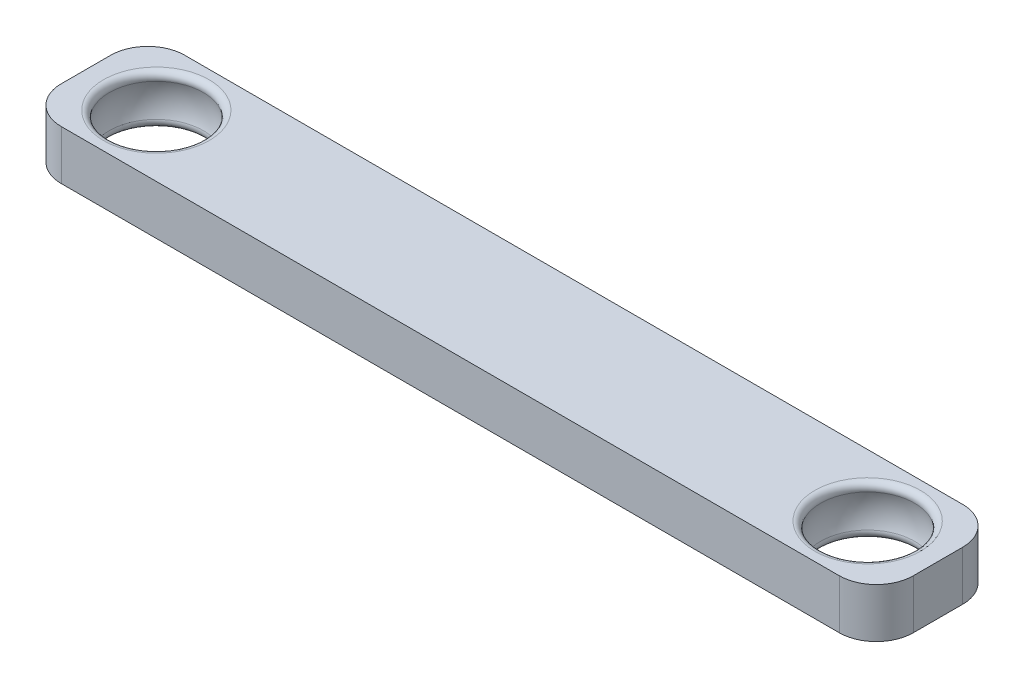
ISO-10303-21;
HEADER;
FILE_DESCRIPTION(('STEP AP214'),'2;1');
FILE_NAME('part.step','',(''),(''),'','','');
FILE_SCHEMA(('AUTOMOTIVE_DESIGN { 1 0 10303 214 1 1 1 1 }'));
ENDSEC;
DATA;
#1=APPLICATION_CONTEXT('core data for automotive mechanical design processes');
#2=APPLICATION_PROTOCOL_DEFINITION('international standard','automotive_design',2000,#1);
#3=PRODUCT_CONTEXT('',#1,'mechanical');
#4=PRODUCT('Part','Part','',(#3));
#5=PRODUCT_RELATED_PRODUCT_CATEGORY('part','',(#4));
#6=PRODUCT_DEFINITION_FORMATION('','',#4);
#7=PRODUCT_DEFINITION_CONTEXT('part definition',#1,'design');
#8=PRODUCT_DEFINITION('design','',#6,#7);
#9=PRODUCT_DEFINITION_SHAPE('','',#8);
#10=(LENGTH_UNIT() NAMED_UNIT(*) SI_UNIT(.MILLI.,.METRE.));
#11=(NAMED_UNIT(*) PLANE_ANGLE_UNIT() SI_UNIT($,.RADIAN.));
#12=(NAMED_UNIT(*) SI_UNIT($,.STERADIAN.) SOLID_ANGLE_UNIT());
#13=UNCERTAINTY_MEASURE_WITH_UNIT(LENGTH_MEASURE(1.E-05),#10,'distance_accuracy_value','');
#14=(GEOMETRIC_REPRESENTATION_CONTEXT(3) GLOBAL_UNCERTAINTY_ASSIGNED_CONTEXT((#13)) GLOBAL_UNIT_ASSIGNED_CONTEXT((#10,
#11,#12)) REPRESENTATION_CONTEXT('',''));
#15=CARTESIAN_POINT('',(0.,0.,0.));
#16=DIRECTION('',(0.,0.,1.));
#17=DIRECTION('',(1.,0.,0.));
#18=AXIS2_PLACEMENT_3D('',#15,#16,#17);
#19=CARTESIAN_POINT('',(34.5,4.,-5.));
#20=DIRECTION('',(-1.,0.,0.));
#21=DIRECTION('',(0.,0.,1.));
#22=AXIS2_PLACEMENT_3D('',#19,#20,#21);
#23=PLANE('',#22);
#24=DIRECTION('',(0.,0.,-1.));
#25=VECTOR('',#24,1.);
#26=CARTESIAN_POINT('',(34.5,0.,-5.));
#27=LINE('',#26,#25);
#28=CARTESIAN_POINT('',(34.5,0.,2.));
#29=VERTEX_POINT('',#28);
#30=CARTESIAN_POINT('',(34.5,0.,-2.));
#31=VERTEX_POINT('',#30);
#32=EDGE_CURVE('E134',#29,#31,#27,.T.);
#33=ORIENTED_EDGE('',*,*,#32,.T.);
#34=DIRECTION('',(0.,-1.,0.));
#35=VECTOR('',#34,1.);
#36=CARTESIAN_POINT('',(34.5,4.,-2.));
#37=LINE('',#36,#35);
#38=CARTESIAN_POINT('',(34.5,4.,-2.));
#39=VERTEX_POINT('',#38);
#40=EDGE_CURVE('E111',#31,#39,#37,.F.);
#41=ORIENTED_EDGE('',*,*,#40,.T.);
#42=DIRECTION('',(0.,0.,-1.));
#43=VECTOR('',#42,1.);
#44=CARTESIAN_POINT('',(34.5,4.,-5.));
#45=LINE('',#44,#43);
#46=CARTESIAN_POINT('',(34.5,4.,2.));
#47=VERTEX_POINT('',#46);
#48=EDGE_CURVE('E141',#47,#39,#45,.T.);
#49=ORIENTED_EDGE('',*,*,#48,.F.);
#50=DIRECTION('',(0.,-1.,0.));
#51=VECTOR('',#50,1.);
#52=CARTESIAN_POINT('',(34.5,4.,2.));
#53=LINE('',#52,#51);
#54=EDGE_CURVE('E116',#47,#29,#53,.T.);
#55=ORIENTED_EDGE('',*,*,#54,.T.);
#56=EDGE_LOOP('',(#33,#41,#49,#55));
#57=FACE_BOUND('',#56,.T.);
#58=ADVANCED_FACE('F39',(#57),#23,.F.);
#59=CARTESIAN_POINT('',(-34.5,4.,-5.));
#60=DIRECTION('',(0.,0.,1.));
#61=DIRECTION('',(1.,0.,0.));
#62=AXIS2_PLACEMENT_3D('',#59,#60,#61);
#63=PLANE('',#62);
#64=DIRECTION('',(-1.,0.,0.));
#65=VECTOR('',#64,1.);
#66=CARTESIAN_POINT('',(-34.5,4.,-5.));
#67=LINE('',#66,#65);
#68=CARTESIAN_POINT('',(31.5,4.,-5.));
#69=VERTEX_POINT('',#68);
#70=CARTESIAN_POINT('',(-31.5,4.,-5.));
#71=VERTEX_POINT('',#70);
#72=EDGE_CURVE('E126',#69,#71,#67,.T.);
#73=ORIENTED_EDGE('',*,*,#72,.F.);
#74=DIRECTION('',(0.,-1.,0.));
#75=VECTOR('',#74,1.);
#76=CARTESIAN_POINT('',(31.5,4.,-5.));
#77=LINE('',#76,#75);
#78=CARTESIAN_POINT('',(31.5,0.,-5.));
#79=VERTEX_POINT('',#78);
#80=EDGE_CURVE('E109',#69,#79,#77,.T.);
#81=ORIENTED_EDGE('',*,*,#80,.T.);
#82=DIRECTION('',(-1.,0.,0.));
#83=VECTOR('',#82,1.);
#84=CARTESIAN_POINT('',(-34.5,0.,-5.));
#85=LINE('',#84,#83);
#86=CARTESIAN_POINT('',(-31.5,0.,-5.));
#87=VERTEX_POINT('',#86);
#88=EDGE_CURVE('E124',#79,#87,#85,.T.);
#89=ORIENTED_EDGE('',*,*,#88,.T.);
#90=DIRECTION('',(0.,-1.,0.));
#91=VECTOR('',#90,1.);
#92=CARTESIAN_POINT('',(-31.5,4.,-5.));
#93=LINE('',#92,#91);
#94=EDGE_CURVE('E127',#87,#71,#93,.F.);
#95=ORIENTED_EDGE('',*,*,#94,.T.);
#96=EDGE_LOOP('',(#73,#81,#89,#95));
#97=FACE_BOUND('',#96,.T.);
#98=ADVANCED_FACE('F125',(#97),#63,.F.);
#99=CARTESIAN_POINT('',(-34.5,4.,-5.));
#100=DIRECTION('',(1.,0.,0.));
#101=DIRECTION('',(0.,0.,-1.));
#102=AXIS2_PLACEMENT_3D('',#99,#100,#101);
#103=PLANE('',#102);
#104=DIRECTION('',(0.,0.,1.));
#105=VECTOR('',#104,1.);
#106=CARTESIAN_POINT('',(-34.5,4.,-5.));
#107=LINE('',#106,#105);
#108=CARTESIAN_POINT('',(-34.5,4.,-2.));
#109=VERTEX_POINT('',#108);
#110=CARTESIAN_POINT('',(-34.5,4.,2.));
#111=VERTEX_POINT('',#110);
#112=EDGE_CURVE('E257',#109,#111,#107,.T.);
#113=ORIENTED_EDGE('',*,*,#112,.F.);
#114=DIRECTION('',(0.,-1.,0.));
#115=VECTOR('',#114,1.);
#116=CARTESIAN_POINT('',(-34.5,4.,-2.));
#117=LINE('',#116,#115);
#118=CARTESIAN_POINT('',(-34.5,0.,-2.));
#119=VERTEX_POINT('',#118);
#120=EDGE_CURVE('E164',#109,#119,#117,.T.);
#121=ORIENTED_EDGE('',*,*,#120,.T.);
#122=DIRECTION('',(0.,0.,1.));
#123=VECTOR('',#122,1.);
#124=CARTESIAN_POINT('',(-34.5,0.,-5.));
#125=LINE('',#124,#123);
#126=CARTESIAN_POINT('',(-34.5,0.,2.));
#127=VERTEX_POINT('',#126);
#128=EDGE_CURVE('E133',#119,#127,#125,.T.);
#129=ORIENTED_EDGE('',*,*,#128,.T.);
#130=DIRECTION('',(0.,-1.,0.));
#131=VECTOR('',#130,1.);
#132=CARTESIAN_POINT('',(-34.5,4.,2.));
#133=LINE('',#132,#131);
#134=EDGE_CURVE('E161',#127,#111,#133,.F.);
#135=ORIENTED_EDGE('',*,*,#134,.T.);
#136=EDGE_LOOP('',(#113,#121,#129,#135));
#137=FACE_BOUND('',#136,.T.);
#138=ADVANCED_FACE('F217',(#137),#103,.F.);
#139=CARTESIAN_POINT('',(-34.5,4.,5.));
#140=DIRECTION('',(0.,0.,-1.));
#141=DIRECTION('',(-1.,0.,0.));
#142=AXIS2_PLACEMENT_3D('',#139,#140,#141);
#143=PLANE('',#142);
#144=DIRECTION('',(1.,0.,0.));
#145=VECTOR('',#144,1.);
#146=CARTESIAN_POINT('',(-34.5,0.,5.));
#147=LINE('',#146,#145);
#148=CARTESIAN_POINT('',(-31.5,0.,5.));
#149=VERTEX_POINT('',#148);
#150=CARTESIAN_POINT('',(31.5,0.,5.));
#151=VERTEX_POINT('',#150);
#152=EDGE_CURVE('E140',#149,#151,#147,.T.);
#153=ORIENTED_EDGE('',*,*,#152,.T.);
#154=DIRECTION('',(0.,-1.,0.));
#155=VECTOR('',#154,1.);
#156=CARTESIAN_POINT('',(31.5,4.,5.));
#157=LINE('',#156,#155);
#158=CARTESIAN_POINT('',(31.5,4.,5.));
#159=VERTEX_POINT('',#158);
#160=EDGE_CURVE('E53',#151,#159,#157,.F.);
#161=ORIENTED_EDGE('',*,*,#160,.T.);
#162=DIRECTION('',(1.,0.,0.));
#163=VECTOR('',#162,1.);
#164=CARTESIAN_POINT('',(-34.5,4.,5.));
#165=LINE('',#164,#163);
#166=CARTESIAN_POINT('',(-31.5,4.,5.));
#167=VERTEX_POINT('',#166);
#168=EDGE_CURVE('E144',#167,#159,#165,.T.);
#169=ORIENTED_EDGE('',*,*,#168,.F.);
#170=DIRECTION('',(0.,-1.,0.));
#171=VECTOR('',#170,1.);
#172=CARTESIAN_POINT('',(-31.5,4.,5.));
#173=LINE('',#172,#171);
#174=EDGE_CURVE('E158',#167,#149,#173,.T.);
#175=ORIENTED_EDGE('',*,*,#174,.T.);
#176=EDGE_LOOP('',(#153,#161,#169,#175));
#177=FACE_BOUND('',#176,.T.);
#178=ADVANCED_FACE('F247',(#177),#143,.F.);
#179=CARTESIAN_POINT('',(0.,4.,0.));
#180=DIRECTION('',(0.,1.,0.));
#181=DIRECTION('',(0.,0.,1.));
#182=AXIS2_PLACEMENT_3D('',#179,#180,#181);
#183=PLANE('',#182);
#184=CARTESIAN_POINT('',(28.8,4.,0.));
#185=DIRECTION('',(0.,1.,0.));
#186=DIRECTION('',(0.,0.,1.));
#187=AXIS2_PLACEMENT_3D('',#184,#185,#186);
#188=CIRCLE('',#187,4.27564367951182);
#189=CARTESIAN_POINT('',(28.8,4.,4.27564367951182));
#190=VERTEX_POINT('',#189);
#191=EDGE_CURVE('E11',#190,#190,#188,.F.);
#192=ORIENTED_EDGE('',*,*,#191,.T.);
#193=EDGE_LOOP('',(#192));
#194=FACE_BOUND('',#193,.T.);
#195=CARTESIAN_POINT('',(-28.8,4.,0.));
#196=DIRECTION('',(0.,1.,0.));
#197=DIRECTION('',(0.,0.,1.));
#198=AXIS2_PLACEMENT_3D('',#195,#196,#197);
#199=CIRCLE('',#198,4.27564367951182);
#200=CARTESIAN_POINT('',(-28.8,4.,4.27564367951182));
#201=VERTEX_POINT('',#200);
#202=EDGE_CURVE('E50',#201,#201,#199,.F.);
#203=ORIENTED_EDGE('',*,*,#202,.T.);
#204=EDGE_LOOP('',(#203));
#205=FACE_BOUND('',#204,.T.);
#206=ORIENTED_EDGE('',*,*,#48,.T.);
#207=CARTESIAN_POINT('',(31.5,4.,-2.));
#208=DIRECTION('',(0.,1.,0.));
#209=DIRECTION('',(0.,0.,1.));
#210=AXIS2_PLACEMENT_3D('',#207,#208,#209);
#211=CIRCLE('',#210,3.);
#212=EDGE_CURVE('E160',#39,#69,#211,.T.);
#213=ORIENTED_EDGE('',*,*,#212,.T.);
#214=ORIENTED_EDGE('',*,*,#72,.T.);
#215=CARTESIAN_POINT('',(-31.5,4.,-2.));
#216=DIRECTION('',(0.,1.,0.));
#217=DIRECTION('',(0.,0.,1.));
#218=AXIS2_PLACEMENT_3D('',#215,#216,#217);
#219=CIRCLE('',#218,3.);
#220=EDGE_CURVE('E153',#71,#109,#219,.T.);
#221=ORIENTED_EDGE('',*,*,#220,.T.);
#222=ORIENTED_EDGE('',*,*,#112,.T.);
#223=CARTESIAN_POINT('',(-31.5,4.,2.));
#224=DIRECTION('',(0.,1.,0.));
#225=DIRECTION('',(0.,0.,1.));
#226=AXIS2_PLACEMENT_3D('',#223,#224,#225);
#227=CIRCLE('',#226,3.);
#228=EDGE_CURVE('E61',#111,#167,#227,.T.);
#229=ORIENTED_EDGE('',*,*,#228,.T.);
#230=ORIENTED_EDGE('',*,*,#168,.T.);
#231=CARTESIAN_POINT('',(31.5,4.,2.));
#232=DIRECTION('',(0.,1.,0.));
#233=DIRECTION('',(0.,0.,1.));
#234=AXIS2_PLACEMENT_3D('',#231,#232,#233);
#235=CIRCLE('',#234,3.);
#236=EDGE_CURVE('E151',#159,#47,#235,.T.);
#237=ORIENTED_EDGE('',*,*,#236,.T.);
#238=EDGE_LOOP('',(#206,#213,#214,#221,#222,#229,#230,#237));
#239=FACE_BOUND('',#238,.T.);
#240=ADVANCED_FACE('F189',(#194,#205,#239),#183,.T.);
#241=CARTESIAN_POINT('',(0.,0.,0.));
#242=DIRECTION('',(0.,1.,0.));
#243=DIRECTION('',(0.,0.,1.));
#244=AXIS2_PLACEMENT_3D('',#241,#242,#243);
#245=PLANE('',#244);
#246=CARTESIAN_POINT('',(-28.8,0.,0.));
#247=DIRECTION('',(0.,1.,0.));
#248=DIRECTION('',(0.,0.,1.));
#249=AXIS2_PLACEMENT_3D('',#246,#247,#248);
#250=CIRCLE('',#249,4.27564367951182);
#251=CARTESIAN_POINT('',(-28.8,0.,4.27564367951182));
#252=VERTEX_POINT('',#251);
#253=EDGE_CURVE('E171',#252,#252,#250,.T.);
#254=ORIENTED_EDGE('',*,*,#253,.T.);
#255=EDGE_LOOP('',(#254));
#256=FACE_BOUND('',#255,.T.);
#257=CARTESIAN_POINT('',(28.8,0.,0.));
#258=DIRECTION('',(0.,1.,0.));
#259=DIRECTION('',(0.,0.,1.));
#260=AXIS2_PLACEMENT_3D('',#257,#258,#259);
#261=CIRCLE('',#260,4.27564367951182);
#262=CARTESIAN_POINT('',(28.8,0.,4.27564367951182));
#263=VERTEX_POINT('',#262);
#264=EDGE_CURVE('E166',#263,#263,#261,.T.);
#265=ORIENTED_EDGE('',*,*,#264,.T.);
#266=EDGE_LOOP('',(#265));
#267=FACE_BOUND('',#266,.T.);
#268=ORIENTED_EDGE('',*,*,#88,.F.);
#269=CARTESIAN_POINT('',(31.5,0.,-2.));
#270=DIRECTION('',(0.,1.,0.));
#271=DIRECTION('',(0.,0.,1.));
#272=AXIS2_PLACEMENT_3D('',#269,#270,#271);
#273=CIRCLE('',#272,3.);
#274=EDGE_CURVE('E106',#79,#31,#273,.F.);
#275=ORIENTED_EDGE('',*,*,#274,.T.);
#276=ORIENTED_EDGE('',*,*,#32,.F.);
#277=CARTESIAN_POINT('',(31.5,0.,2.));
#278=DIRECTION('',(0.,1.,0.));
#279=DIRECTION('',(0.,0.,1.));
#280=AXIS2_PLACEMENT_3D('',#277,#278,#279);
#281=CIRCLE('',#280,3.);
#282=EDGE_CURVE('E120',#29,#151,#281,.F.);
#283=ORIENTED_EDGE('',*,*,#282,.T.);
#284=ORIENTED_EDGE('',*,*,#152,.F.);
#285=CARTESIAN_POINT('',(-31.5,0.,2.));
#286=DIRECTION('',(0.,1.,0.));
#287=DIRECTION('',(0.,0.,1.));
#288=AXIS2_PLACEMENT_3D('',#285,#286,#287);
#289=CIRCLE('',#288,3.);
#290=EDGE_CURVE('E130',#149,#127,#289,.F.);
#291=ORIENTED_EDGE('',*,*,#290,.T.);
#292=ORIENTED_EDGE('',*,*,#128,.F.);
#293=CARTESIAN_POINT('',(-31.5,0.,-2.));
#294=DIRECTION('',(0.,1.,0.));
#295=DIRECTION('',(0.,0.,1.));
#296=AXIS2_PLACEMENT_3D('',#293,#294,#295);
#297=CIRCLE('',#296,3.);
#298=EDGE_CURVE('E135',#119,#87,#297,.F.);
#299=ORIENTED_EDGE('',*,*,#298,.T.);
#300=EDGE_LOOP('',(#268,#275,#276,#283,#284,#291,#292,#299));
#301=FACE_BOUND('',#300,.T.);
#302=ADVANCED_FACE('F129',(#256,#267,#301),#245,.F.);
#303=CARTESIAN_POINT('',(-28.8,2.,0.));
#304=DIRECTION('',(0.,1.,0.));
#305=DIRECTION('',(-1.,0.,0.));
#306=AXIS2_PLACEMENT_3D('',#303,#304,#305);
#307=SPHERICAL_SURFACE('',#306,4.03112887414928);
#308=CARTESIAN_POINT('',(-28.8,0.665521665975747,0.));
#309=DIRECTION('',(0.,1.,0.));
#310=DIRECTION('',(0.,0.,1.));
#311=AXIS2_PLACEMENT_3D('',#308,#309,#310);
#312=CIRCLE('',#311,3.8038359028775);
#313=CARTESIAN_POINT('',(-32.6038359028775,0.665521665975747,0.));
#314=VERTEX_POINT('',#313);
#315=EDGE_CURVE('E180',#314,#314,#312,.F.);
#316=CARTESIAN_POINT('',(-28.8,3.33447833402425,0.));
#317=DIRECTION('',(0.,-1.,0.));
#318=DIRECTION('',(0.,0.,-1.));
#319=AXIS2_PLACEMENT_3D('',#316,#317,#318);
#320=CIRCLE('',#319,3.8038359028775);
#321=CARTESIAN_POINT('',(-32.6038359028775,3.33447833402425,0.));
#322=VERTEX_POINT('',#321);
#323=EDGE_CURVE('E172',#322,#322,#320,.F.);
#324=CARTESIAN_POINT('',(-32.6038359028775,0.665521665975747,0.));
#325=CARTESIAN_POINT('',(-32.613216470049,0.692260163696228,0.));
#326=CARTESIAN_POINT('',(-32.6223150164849,0.719097599316743,0.));
#327=CARTESIAN_POINT('',(-32.6399442210205,0.772958346828976,0.));
#328=CARTESIAN_POINT('',(-32.6484748791202,0.799981658720694,0.));
#329=CARTESIAN_POINT('',(-32.6649644601183,0.854202159246467,0.));
#330=CARTESIAN_POINT('',(-32.6729233830168,0.881399347880521,0.));
#331=CARTESIAN_POINT('',(-32.6882659686585,0.93595550289289,0.));
#332=CARTESIAN_POINT('',(-32.6956496314019,0.963314469271204,0.));
#333=CARTESIAN_POINT('',(-32.709838409461,1.0181820147676,0.));
#334=CARTESIAN_POINT('',(-32.7166435247767,1.04569059388568,0.));
#335=CARTESIAN_POINT('',(-32.7296721828406,1.10084513173569,0.));
#336=CARTESIAN_POINT('',(-32.7358957255888,1.12849109046761,0.));
#337=CARTESIAN_POINT('',(-32.7477584706951,1.18390809375409,0.));
#338=CARTESIAN_POINT('',(-32.7533976730534,1.21167913830865,0.));
#339=CARTESIAN_POINT('',(-32.7640892297568,1.26733396371065,0.));
#340=CARTESIAN_POINT('',(-32.769141584102,1.29521774455809,0.));
#341=CARTESIAN_POINT('',(-32.7786571980282,1.35108564291394,0.));
#342=CARTESIAN_POINT('',(-32.7831204576092,1.37906976042237,0.));
#343=CARTESIAN_POINT('',(-32.7914558972453,1.43512588784141,0.));
#344=CARTESIAN_POINT('',(-32.7953280773004,1.46319789775203,0.));
#345=CARTESIAN_POINT('',(-32.8024796359638,1.519417326634,0.));
#346=CARTESIAN_POINT('',(-32.805759014572,1.54756474560535,0.));
#347=CARTESIAN_POINT('',(-32.811723512035,1.60392247573308,0.));
#348=CARTESIAN_POINT('',(-32.8144086308897,1.63213278688946,0.));
#349=CARTESIAN_POINT('',(-32.8191834148003,1.68860375654416,0.));
#350=CARTESIAN_POINT('',(-32.821273079856,1.71686441504248,0.));
#351=CARTESIAN_POINT('',(-32.8248560269154,1.773423512149,0.));
#352=CARTESIAN_POINT('',(-32.826349308919,1.8017219507572,0.));
#353=CARTESIAN_POINT('',(-32.8287388258265,1.85834402405095,0.));
#354=CARTESIAN_POINT('',(-32.8296350607304,1.88666765873651,0.));
#355=CARTESIAN_POINT('',(-32.8308300848918,1.94332752894805,0.));
#356=CARTESIAN_POINT('',(-32.8311288741493,1.97166376447402,0.));
#357=CARTESIAN_POINT('',(-32.8311288741493,2.02833623552598,0.));
#358=CARTESIAN_POINT('',(-32.8308300848918,2.05667247105195,0.));
#359=CARTESIAN_POINT('',(-32.8296350607304,2.11333234126349,0.));
#360=CARTESIAN_POINT('',(-32.8287388258265,2.14165597594905,0.));
#361=CARTESIAN_POINT('',(-32.826349308919,2.1982780492428,0.));
#362=CARTESIAN_POINT('',(-32.8248560269154,2.226576487851,0.));
#363=CARTESIAN_POINT('',(-32.821273079856,2.28313558495752,0.));
#364=CARTESIAN_POINT('',(-32.8191834148003,2.31139624345584,0.));
#365=CARTESIAN_POINT('',(-32.8144086308897,2.36786721311054,0.));
#366=CARTESIAN_POINT('',(-32.811723512035,2.39607752426692,0.));
#367=CARTESIAN_POINT('',(-32.805759014572,2.45243525439465,0.));
#368=CARTESIAN_POINT('',(-32.8024796359638,2.480582673366,0.));
#369=CARTESIAN_POINT('',(-32.7953280773004,2.53680210224797,0.));
#370=CARTESIAN_POINT('',(-32.7914558972453,2.56487411215859,0.));
#371=CARTESIAN_POINT('',(-32.7831204576092,2.62093023957763,0.));
#372=CARTESIAN_POINT('',(-32.7786571980282,2.64891435708606,0.));
#373=CARTESIAN_POINT('',(-32.769141584102,2.70478225544191,0.));
#374=CARTESIAN_POINT('',(-32.7640892297568,2.73266603628935,0.));
#375=CARTESIAN_POINT('',(-32.7533976730534,2.78832086169135,0.));
#376=CARTESIAN_POINT('',(-32.7477584706951,2.81609190624591,0.));
#377=CARTESIAN_POINT('',(-32.7358957255888,2.87150890953239,0.));
#378=CARTESIAN_POINT('',(-32.7296721828406,2.89915486826431,0.));
#379=CARTESIAN_POINT('',(-32.7166435247767,2.95430940611432,0.));
#380=CARTESIAN_POINT('',(-32.709838409461,2.9818179852324,0.));
#381=CARTESIAN_POINT('',(-32.6956496314019,3.0366855307288,0.));
#382=CARTESIAN_POINT('',(-32.6882659686585,3.06404449710711,0.));
#383=CARTESIAN_POINT('',(-32.6729233830168,3.11860065211948,0.));
#384=CARTESIAN_POINT('',(-32.6649644601183,3.14579784075353,0.));
#385=CARTESIAN_POINT('',(-32.6484748791202,3.20001834127931,0.));
#386=CARTESIAN_POINT('',(-32.6399442210205,3.22704165317102,0.));
#387=CARTESIAN_POINT('',(-32.6223150164849,3.28090240068326,0.));
#388=CARTESIAN_POINT('',(-32.613216470049,3.30773983630377,0.));
#389=CARTESIAN_POINT('',(-32.6038359028775,3.33447833402425,0.));
#390=B_SPLINE_CURVE_WITH_KNOTS('',3,(#324,#325,#326,#327,#328,#329,#330,#331,#332,#333,#334,
#335,#336,#337,#338,#339,#340,#341,#342,#343,#344,#345,#346,#347,#348,#349,#350,#351,#352,#353,
#354,#355,#356,#357,#358,#359,#360,#361,#362,#363,#364,#365,#366,#367,#368,#369,#370,#371,#372,
#373,#374,#375,#376,#377,#378,#379,#380,#381,#382,#383,#384,#385,#386,#387,#388,#389),
.UNSPECIFIED.,.F.,.F.,(4,2,2,2,2,2,2,2,2,2,2,2,2,2,2,2,2,2,2,2,2,2,2,2,2,2,2,2,2,2,2,2,4),(0.,
0.0850071315166616,0.170014263033325,0.255021394549988,0.340028526066651,0.425035657583315,
0.510042789099977,0.59504992061664,0.680057052133303,0.765064183649966,0.850071315166629,
0.935078446683292,1.02008557819996,1.10509270971662,1.19009984123328,1.27510697274994,
1.36011410426661,1.44512123578327,1.53012836729993,1.6151354988166,1.70014263033326,
1.78514976184992,1.87015689336659,1.95516402488325,2.04017115639991,2.12517828791657,
2.21018541943324,2.2951925509499,2.38019968246656,2.46520681398323,2.55021394549989,
2.63522107701655,2.72022820853321),.UNSPECIFIED.);
#391=EDGE_CURVE('BSEAM194',#314,#322,#390,.T.);
#392=ORIENTED_EDGE('',*,*,#315,.T.);
#393=ORIENTED_EDGE('',*,*,#323,.T.);
#394=ORIENTED_EDGE('',*,*,#391,.T.);
#395=ORIENTED_EDGE('',*,*,#391,.F.);
#396=EDGE_LOOP('',(#392,#394,#393,#395));
#397=FACE_BOUND('',#396,.T.);
#398=ADVANCED_FACE('F194',(#397),#307,.F.);
#399=CARTESIAN_POINT('',(31.5,4.,-2.));
#400=DIRECTION('',(0.,-1.,0.));
#401=DIRECTION('',(0.,0.,-1.));
#402=AXIS2_PLACEMENT_3D('',#399,#400,#401);
#403=CYLINDRICAL_SURFACE('',#402,3.);
#404=ORIENTED_EDGE('',*,*,#212,.F.);
#405=ORIENTED_EDGE('',*,*,#40,.F.);
#406=ORIENTED_EDGE('',*,*,#274,.F.);
#407=ORIENTED_EDGE('',*,*,#80,.F.);
#408=EDGE_LOOP('',(#404,#405,#406,#407));
#409=FACE_BOUND('',#408,.T.);
#410=ADVANCED_FACE('F107',(#409),#403,.T.);
#411=CARTESIAN_POINT('',(31.5,4.,2.));
#412=DIRECTION('',(0.,-1.,0.));
#413=DIRECTION('',(0.,0.,-1.));
#414=AXIS2_PLACEMENT_3D('',#411,#412,#413);
#415=CYLINDRICAL_SURFACE('',#414,3.);
#416=ORIENTED_EDGE('',*,*,#236,.F.);
#417=ORIENTED_EDGE('',*,*,#160,.F.);
#418=ORIENTED_EDGE('',*,*,#282,.F.);
#419=ORIENTED_EDGE('',*,*,#54,.F.);
#420=EDGE_LOOP('',(#416,#417,#418,#419));
#421=FACE_BOUND('',#420,.T.);
#422=ADVANCED_FACE('F203',(#421),#415,.T.);
#423=CARTESIAN_POINT('',(-31.5,4.,-2.));
#424=DIRECTION('',(0.,-1.,0.));
#425=DIRECTION('',(0.,0.,-1.));
#426=AXIS2_PLACEMENT_3D('',#423,#424,#425);
#427=CYLINDRICAL_SURFACE('',#426,3.);
#428=ORIENTED_EDGE('',*,*,#220,.F.);
#429=ORIENTED_EDGE('',*,*,#94,.F.);
#430=ORIENTED_EDGE('',*,*,#298,.F.);
#431=ORIENTED_EDGE('',*,*,#120,.F.);
#432=EDGE_LOOP('',(#428,#429,#430,#431));
#433=FACE_BOUND('',#432,.T.);
#434=ADVANCED_FACE('F225',(#433),#427,.T.);
#435=CARTESIAN_POINT('',(-31.5,4.,2.));
#436=DIRECTION('',(0.,-1.,0.));
#437=DIRECTION('',(0.,0.,-1.));
#438=AXIS2_PLACEMENT_3D('',#435,#436,#437);
#439=CYLINDRICAL_SURFACE('',#438,3.);
#440=ORIENTED_EDGE('',*,*,#228,.F.);
#441=ORIENTED_EDGE('',*,*,#134,.F.);
#442=ORIENTED_EDGE('',*,*,#290,.F.);
#443=ORIENTED_EDGE('',*,*,#174,.F.);
#444=EDGE_LOOP('',(#440,#441,#442,#443));
#445=FACE_BOUND('',#444,.T.);
#446=ADVANCED_FACE('F228',(#445),#439,.T.);
#447=CARTESIAN_POINT('',(28.8,2.,0.));
#448=DIRECTION('',(0.,1.,0.));
#449=DIRECTION('',(1.,0.,0.));
#450=AXIS2_PLACEMENT_3D('',#447,#448,#449);
#451=SPHERICAL_SURFACE('',#450,4.03112887414928);
#452=CARTESIAN_POINT('',(28.8,0.665521665975747,0.));
#453=DIRECTION('',(0.,1.,0.));
#454=DIRECTION('',(0.,0.,1.));
#455=AXIS2_PLACEMENT_3D('',#452,#453,#454);
#456=CIRCLE('',#455,3.8038359028775);
#457=CARTESIAN_POINT('',(32.6038359028775,0.665521665975747,0.));
#458=VERTEX_POINT('',#457);
#459=EDGE_CURVE('E182',#458,#458,#456,.F.);
#460=CARTESIAN_POINT('',(28.8,3.33447833402425,0.));
#461=DIRECTION('',(0.,-1.,0.));
#462=DIRECTION('',(0.,0.,-1.));
#463=AXIS2_PLACEMENT_3D('',#460,#461,#462);
#464=CIRCLE('',#463,3.8038359028775);
#465=CARTESIAN_POINT('',(32.6038359028775,3.33447833402425,0.));
#466=VERTEX_POINT('',#465);
#467=EDGE_CURVE('E179',#466,#466,#464,.F.);
#468=CARTESIAN_POINT('',(32.6038359028775,0.665521665975747,0.));
#469=CARTESIAN_POINT('',(32.613216470049,0.692260163696228,0.));
#470=CARTESIAN_POINT('',(32.6223150164849,0.719097599316743,0.));
#471=CARTESIAN_POINT('',(32.6399442210205,0.772958346828976,0.));
#472=CARTESIAN_POINT('',(32.6484748791202,0.799981658720694,0.));
#473=CARTESIAN_POINT('',(32.6649644601183,0.854202159246467,0.));
#474=CARTESIAN_POINT('',(32.6729233830168,0.881399347880521,0.));
#475=CARTESIAN_POINT('',(32.6882659686585,0.93595550289289,0.));
#476=CARTESIAN_POINT('',(32.6956496314019,0.963314469271204,0.));
#477=CARTESIAN_POINT('',(32.709838409461,1.0181820147676,0.));
#478=CARTESIAN_POINT('',(32.7166435247767,1.04569059388568,0.));
#479=CARTESIAN_POINT('',(32.7296721828406,1.10084513173569,0.));
#480=CARTESIAN_POINT('',(32.7358957255888,1.12849109046761,0.));
#481=CARTESIAN_POINT('',(32.7477584706951,1.18390809375409,0.));
#482=CARTESIAN_POINT('',(32.7533976730534,1.21167913830865,0.));
#483=CARTESIAN_POINT('',(32.7640892297568,1.26733396371065,0.));
#484=CARTESIAN_POINT('',(32.769141584102,1.29521774455809,0.));
#485=CARTESIAN_POINT('',(32.7786571980282,1.35108564291394,0.));
#486=CARTESIAN_POINT('',(32.7831204576092,1.37906976042237,0.));
#487=CARTESIAN_POINT('',(32.7914558972453,1.43512588784141,0.));
#488=CARTESIAN_POINT('',(32.7953280773004,1.46319789775203,0.));
#489=CARTESIAN_POINT('',(32.8024796359638,1.519417326634,0.));
#490=CARTESIAN_POINT('',(32.805759014572,1.54756474560535,0.));
#491=CARTESIAN_POINT('',(32.811723512035,1.60392247573308,0.));
#492=CARTESIAN_POINT('',(32.8144086308897,1.63213278688946,0.));
#493=CARTESIAN_POINT('',(32.8191834148003,1.68860375654416,0.));
#494=CARTESIAN_POINT('',(32.821273079856,1.71686441504248,0.));
#495=CARTESIAN_POINT('',(32.8248560269154,1.773423512149,0.));
#496=CARTESIAN_POINT('',(32.826349308919,1.8017219507572,0.));
#497=CARTESIAN_POINT('',(32.8287388258265,1.85834402405095,0.));
#498=CARTESIAN_POINT('',(32.8296350607304,1.88666765873651,0.));
#499=CARTESIAN_POINT('',(32.8308300848918,1.94332752894805,0.));
#500=CARTESIAN_POINT('',(32.8311288741493,1.97166376447402,0.));
#501=CARTESIAN_POINT('',(32.8311288741493,2.02833623552598,0.));
#502=CARTESIAN_POINT('',(32.8308300848918,2.05667247105195,0.));
#503=CARTESIAN_POINT('',(32.8296350607304,2.11333234126349,0.));
#504=CARTESIAN_POINT('',(32.8287388258265,2.14165597594905,0.));
#505=CARTESIAN_POINT('',(32.826349308919,2.1982780492428,0.));
#506=CARTESIAN_POINT('',(32.8248560269154,2.226576487851,0.));
#507=CARTESIAN_POINT('',(32.821273079856,2.28313558495752,0.));
#508=CARTESIAN_POINT('',(32.8191834148003,2.31139624345584,0.));
#509=CARTESIAN_POINT('',(32.8144086308897,2.36786721311054,0.));
#510=CARTESIAN_POINT('',(32.811723512035,2.39607752426692,0.));
#511=CARTESIAN_POINT('',(32.805759014572,2.45243525439465,0.));
#512=CARTESIAN_POINT('',(32.8024796359638,2.480582673366,0.));
#513=CARTESIAN_POINT('',(32.7953280773004,2.53680210224797,0.));
#514=CARTESIAN_POINT('',(32.7914558972453,2.56487411215859,0.));
#515=CARTESIAN_POINT('',(32.7831204576092,2.62093023957763,0.));
#516=CARTESIAN_POINT('',(32.7786571980282,2.64891435708606,0.));
#517=CARTESIAN_POINT('',(32.769141584102,2.70478225544191,0.));
#518=CARTESIAN_POINT('',(32.7640892297568,2.73266603628935,0.));
#519=CARTESIAN_POINT('',(32.7533976730534,2.78832086169135,0.));
#520=CARTESIAN_POINT('',(32.7477584706951,2.81609190624591,0.));
#521=CARTESIAN_POINT('',(32.7358957255888,2.87150890953239,0.));
#522=CARTESIAN_POINT('',(32.7296721828406,2.89915486826431,0.));
#523=CARTESIAN_POINT('',(32.7166435247767,2.95430940611432,0.));
#524=CARTESIAN_POINT('',(32.709838409461,2.9818179852324,0.));
#525=CARTESIAN_POINT('',(32.6956496314019,3.0366855307288,0.));
#526=CARTESIAN_POINT('',(32.6882659686585,3.06404449710711,0.));
#527=CARTESIAN_POINT('',(32.6729233830168,3.11860065211948,0.));
#528=CARTESIAN_POINT('',(32.6649644601183,3.14579784075353,0.));
#529=CARTESIAN_POINT('',(32.6484748791202,3.20001834127931,0.));
#530=CARTESIAN_POINT('',(32.6399442210205,3.22704165317102,0.));
#531=CARTESIAN_POINT('',(32.6223150164849,3.28090240068326,0.));
#532=CARTESIAN_POINT('',(32.613216470049,3.30773983630377,0.));
#533=CARTESIAN_POINT('',(32.6038359028775,3.33447833402425,0.));
#534=B_SPLINE_CURVE_WITH_KNOTS('',3,(#468,#469,#470,#471,#472,#473,#474,#475,#476,#477,#478,
#479,#480,#481,#482,#483,#484,#485,#486,#487,#488,#489,#490,#491,#492,#493,#494,#495,#496,#497,
#498,#499,#500,#501,#502,#503,#504,#505,#506,#507,#508,#509,#510,#511,#512,#513,#514,#515,#516,
#517,#518,#519,#520,#521,#522,#523,#524,#525,#526,#527,#528,#529,#530,#531,#532,#533),
.UNSPECIFIED.,.F.,.F.,(4,2,2,2,2,2,2,2,2,2,2,2,2,2,2,2,2,2,2,2,2,2,2,2,2,2,2,2,2,2,2,2,4),(0.,
0.0850071315166616,0.170014263033325,0.255021394549988,0.340028526066651,0.425035657583315,
0.510042789099977,0.59504992061664,0.680057052133303,0.765064183649966,0.850071315166629,
0.935078446683292,1.02008557819996,1.10509270971662,1.19009984123328,1.27510697274994,
1.36011410426661,1.44512123578327,1.53012836729993,1.6151354988166,1.70014263033326,
1.78514976184992,1.87015689336659,1.95516402488325,2.04017115639991,2.12517828791657,
2.21018541943324,2.2951925509499,2.38019968246656,2.46520681398323,2.55021394549989,
2.63522107701655,2.72022820853321),.UNSPECIFIED.);
#535=EDGE_CURVE('BSEAM229',#458,#466,#534,.T.);
#536=ORIENTED_EDGE('',*,*,#459,.T.);
#537=ORIENTED_EDGE('',*,*,#467,.T.);
#538=ORIENTED_EDGE('',*,*,#535,.T.);
#539=ORIENTED_EDGE('',*,*,#535,.F.);
#540=EDGE_LOOP('',(#536,#538,#537,#539));
#541=FACE_BOUND('',#540,.T.);
#542=ADVANCED_FACE('F229',(#541),#451,.F.);
#543=CARTESIAN_POINT('',(-28.8,0.5,0.));
#544=DIRECTION('',(0.,1.,0.));
#545=DIRECTION('',(0.,0.,1.));
#546=AXIS2_PLACEMENT_3D('',#543,#544,#545);
#547=TOROIDAL_SURFACE('',#546,4.27564367951182,0.5);
#548=ORIENTED_EDGE('',*,*,#315,.F.);
#549=EDGE_LOOP('',(#548));
#550=FACE_BOUND('',#549,.T.);
#551=ORIENTED_EDGE('',*,*,#253,.F.);
#552=EDGE_LOOP('',(#551));
#553=FACE_BOUND('',#552,.T.);
#554=ADVANCED_FACE('F235',(#550,#553),#547,.T.);
#555=CARTESIAN_POINT('',(28.8,0.5,0.));
#556=DIRECTION('',(0.,1.,0.));
#557=DIRECTION('',(0.,0.,1.));
#558=AXIS2_PLACEMENT_3D('',#555,#556,#557);
#559=TOROIDAL_SURFACE('',#558,4.27564367951182,0.5);
#560=ORIENTED_EDGE('',*,*,#264,.F.);
#561=EDGE_LOOP('',(#560));
#562=FACE_BOUND('',#561,.T.);
#563=ORIENTED_EDGE('',*,*,#459,.F.);
#564=EDGE_LOOP('',(#563));
#565=FACE_BOUND('',#564,.T.);
#566=ADVANCED_FACE('F232',(#562,#565),#559,.T.);
#567=CARTESIAN_POINT('',(28.8,3.5,0.));
#568=DIRECTION('',(0.,1.,0.));
#569=DIRECTION('',(0.,0.,1.));
#570=AXIS2_PLACEMENT_3D('',#567,#568,#569);
#571=TOROIDAL_SURFACE('',#570,4.27564367951182,0.5);
#572=ORIENTED_EDGE('',*,*,#467,.F.);
#573=EDGE_LOOP('',(#572));
#574=FACE_BOUND('',#573,.T.);
#575=ORIENTED_EDGE('',*,*,#191,.F.);
#576=EDGE_LOOP('',(#575));
#577=FACE_BOUND('',#576,.T.);
#578=ADVANCED_FACE('F195',(#574,#577),#571,.T.);
#579=CARTESIAN_POINT('',(-28.8,3.5,0.));
#580=DIRECTION('',(0.,1.,0.));
#581=DIRECTION('',(0.,0.,1.));
#582=AXIS2_PLACEMENT_3D('',#579,#580,#581);
#583=TOROIDAL_SURFACE('',#582,4.27564367951182,0.5);
#584=ORIENTED_EDGE('',*,*,#202,.F.);
#585=EDGE_LOOP('',(#584));
#586=FACE_BOUND('',#585,.T.);
#587=ORIENTED_EDGE('',*,*,#323,.F.);
#588=EDGE_LOOP('',(#587));
#589=FACE_BOUND('',#588,.T.);
#590=ADVANCED_FACE('F41',(#586,#589),#583,.T.);
#591=CLOSED_SHELL('',(#58,#98,#138,#178,#240,#302,#398,#410,#422,#434,#446,#542,#554,#566,#578,#590));
#592=MANIFOLD_SOLID_BREP('B2',#591);
#593=ADVANCED_BREP_SHAPE_REPRESENTATION('',(#18,#592),#14);
#594=SHAPE_DEFINITION_REPRESENTATION(#9,#593);
ENDSEC;
END-ISO-10303-21;
